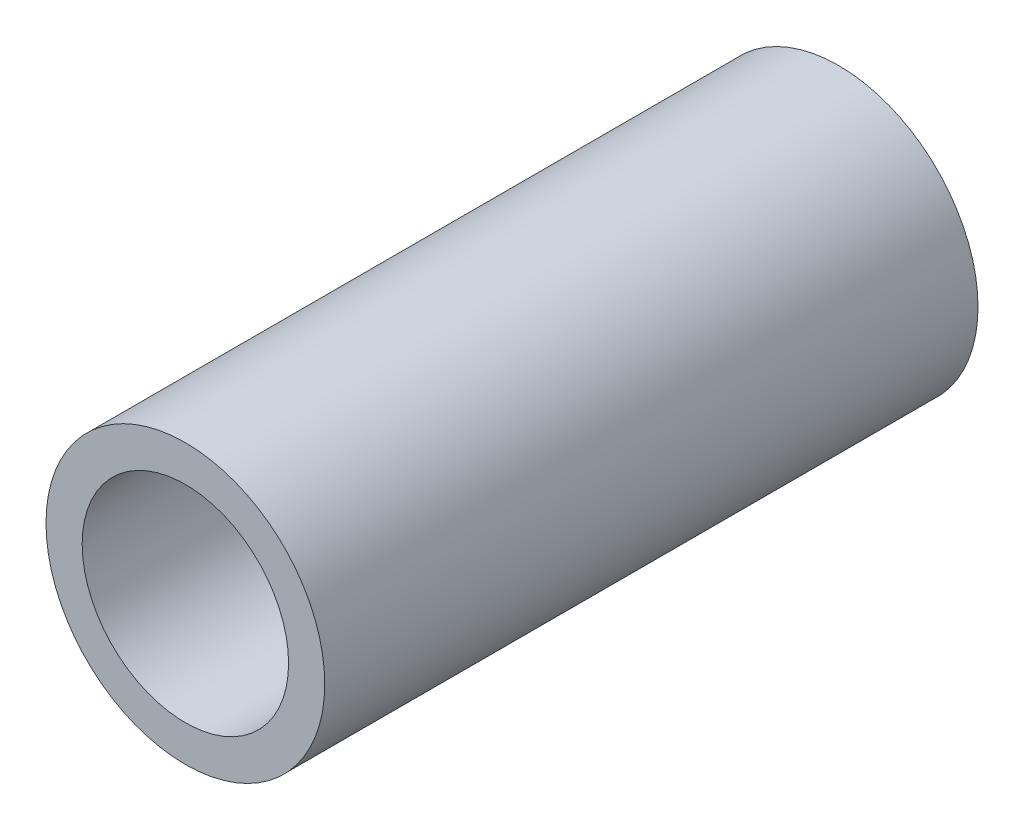
ISO-10303-21;
HEADER;
FILE_DESCRIPTION(('STEP AP214'),'2;1');
FILE_NAME('part.step','',(''),(''),'','','');
FILE_SCHEMA(('AUTOMOTIVE_DESIGN { 1 0 10303 214 1 1 1 1 }'));
ENDSEC;
DATA;
#1=APPLICATION_CONTEXT('core data for automotive mechanical design processes');
#2=APPLICATION_PROTOCOL_DEFINITION('international standard','automotive_design',2000,#1);
#3=PRODUCT_CONTEXT('',#1,'mechanical');
#4=PRODUCT('Part','Part','',(#3));
#5=PRODUCT_RELATED_PRODUCT_CATEGORY('part','',(#4));
#6=PRODUCT_DEFINITION_FORMATION('','',#4);
#7=PRODUCT_DEFINITION_CONTEXT('part definition',#1,'design');
#8=PRODUCT_DEFINITION('design','',#6,#7);
#9=PRODUCT_DEFINITION_SHAPE('','',#8);
#10=(LENGTH_UNIT() NAMED_UNIT(*) SI_UNIT(.MILLI.,.METRE.));
#11=(NAMED_UNIT(*) PLANE_ANGLE_UNIT() SI_UNIT($,.RADIAN.));
#12=(NAMED_UNIT(*) SI_UNIT($,.STERADIAN.) SOLID_ANGLE_UNIT());
#13=UNCERTAINTY_MEASURE_WITH_UNIT(LENGTH_MEASURE(1.E-05),#10,'distance_accuracy_value','');
#14=(GEOMETRIC_REPRESENTATION_CONTEXT(3) GLOBAL_UNCERTAINTY_ASSIGNED_CONTEXT((#13)) GLOBAL_UNIT_ASSIGNED_CONTEXT((#10,
#11,#12)) REPRESENTATION_CONTEXT('',''));
#15=CARTESIAN_POINT('',(0.,0.,0.));
#16=DIRECTION('',(0.,0.,1.));
#17=DIRECTION('',(1.,0.,0.));
#18=AXIS2_PLACEMENT_3D('',#15,#16,#17);
#19=CARTESIAN_POINT('',(0.,0.,25.));
#20=DIRECTION('',(0.,0.,1.));
#21=DIRECTION('',(1.,0.,0.));
#22=AXIS2_PLACEMENT_3D('',#19,#20,#21);
#23=PLANE('',#22);
#24=CARTESIAN_POINT('',(0.,0.,25.));
#25=DIRECTION('',(0.,0.,1.));
#26=DIRECTION('',(1.,0.,0.));
#27=AXIS2_PLACEMENT_3D('',#24,#25,#26);
#28=CIRCLE('',#27,10.668);
#29=CARTESIAN_POINT('',(10.668,0.,25.));
#30=VERTEX_POINT('',#29);
#31=EDGE_CURVE('E11',#30,#30,#28,.T.);
#32=ORIENTED_EDGE('',*,*,#31,.T.);
#33=EDGE_LOOP('',(#32));
#34=FACE_BOUND('',#33,.T.);
#35=CARTESIAN_POINT('',(0.,0.,25.));
#36=DIRECTION('',(0.,0.,1.));
#37=DIRECTION('',(1.,0.,0.));
#38=AXIS2_PLACEMENT_3D('',#35,#36,#37);
#39=CIRCLE('',#38,7.8994);
#40=CARTESIAN_POINT('',(7.8994,0.,25.));
#41=VERTEX_POINT('',#40);
#42=EDGE_CURVE('E47',#41,#41,#39,.T.);
#43=ORIENTED_EDGE('',*,*,#42,.F.);
#44=EDGE_LOOP('',(#43));
#45=FACE_BOUND('',#44,.T.);
#46=ADVANCED_FACE('F36',(#34,#45),#23,.T.);
#47=CARTESIAN_POINT('',(0.,0.,-25.));
#48=DIRECTION('',(0.,0.,1.));
#49=DIRECTION('',(1.,0.,0.));
#50=AXIS2_PLACEMENT_3D('',#47,#48,#49);
#51=PLANE('',#50);
#52=CARTESIAN_POINT('',(0.,0.,-25.));
#53=DIRECTION('',(0.,0.,1.));
#54=DIRECTION('',(1.,0.,0.));
#55=AXIS2_PLACEMENT_3D('',#52,#53,#54);
#56=CIRCLE('',#55,10.668);
#57=CARTESIAN_POINT('',(10.668,0.,-25.));
#58=VERTEX_POINT('',#57);
#59=EDGE_CURVE('E40',#58,#58,#56,.T.);
#60=ORIENTED_EDGE('',*,*,#59,.F.);
#61=EDGE_LOOP('',(#60));
#62=FACE_BOUND('',#61,.T.);
#63=CARTESIAN_POINT('',(0.,0.,-25.));
#64=DIRECTION('',(0.,0.,1.));
#65=DIRECTION('',(1.,0.,0.));
#66=AXIS2_PLACEMENT_3D('',#63,#64,#65);
#67=CIRCLE('',#66,7.8994);
#68=CARTESIAN_POINT('',(7.8994,0.,-25.));
#69=VERTEX_POINT('',#68);
#70=EDGE_CURVE('E49',#69,#69,#67,.T.);
#71=ORIENTED_EDGE('',*,*,#70,.T.);
#72=EDGE_LOOP('',(#71));
#73=FACE_BOUND('',#72,.T.);
#74=ADVANCED_FACE('F59',(#62,#73),#51,.F.);
#75=CARTESIAN_POINT('',(0.,0.,25.));
#76=DIRECTION('',(0.,0.,-1.));
#77=DIRECTION('',(-1.,0.,0.));
#78=AXIS2_PLACEMENT_3D('',#75,#76,#77);
#79=CYLINDRICAL_SURFACE('',#78,10.668);
#80=ORIENTED_EDGE('',*,*,#31,.F.);
#81=EDGE_LOOP('',(#80));
#82=FACE_BOUND('',#81,.T.);
#83=ORIENTED_EDGE('',*,*,#59,.T.);
#84=EDGE_LOOP('',(#83));
#85=FACE_BOUND('',#84,.T.);
#86=ADVANCED_FACE('F38',(#82,#85),#79,.T.);
#87=CARTESIAN_POINT('',(0.,0.,25.));
#88=DIRECTION('',(0.,0.,-1.));
#89=DIRECTION('',(-1.,0.,0.));
#90=AXIS2_PLACEMENT_3D('',#87,#88,#89);
#91=CYLINDRICAL_SURFACE('',#90,7.8994);
#92=ORIENTED_EDGE('',*,*,#42,.T.);
#93=EDGE_LOOP('',(#92));
#94=FACE_BOUND('',#93,.T.);
#95=ORIENTED_EDGE('',*,*,#70,.F.);
#96=EDGE_LOOP('',(#95));
#97=FACE_BOUND('',#96,.T.);
#98=ADVANCED_FACE('F55',(#94,#97),#91,.F.);
#99=CLOSED_SHELL('',(#46,#74,#86,#98));
#100=MANIFOLD_SOLID_BREP('B2',#99);
#101=ADVANCED_BREP_SHAPE_REPRESENTATION('',(#18,#100),#14);
#102=SHAPE_DEFINITION_REPRESENTATION(#9,#101);
ENDSEC;
END-ISO-10303-21;
